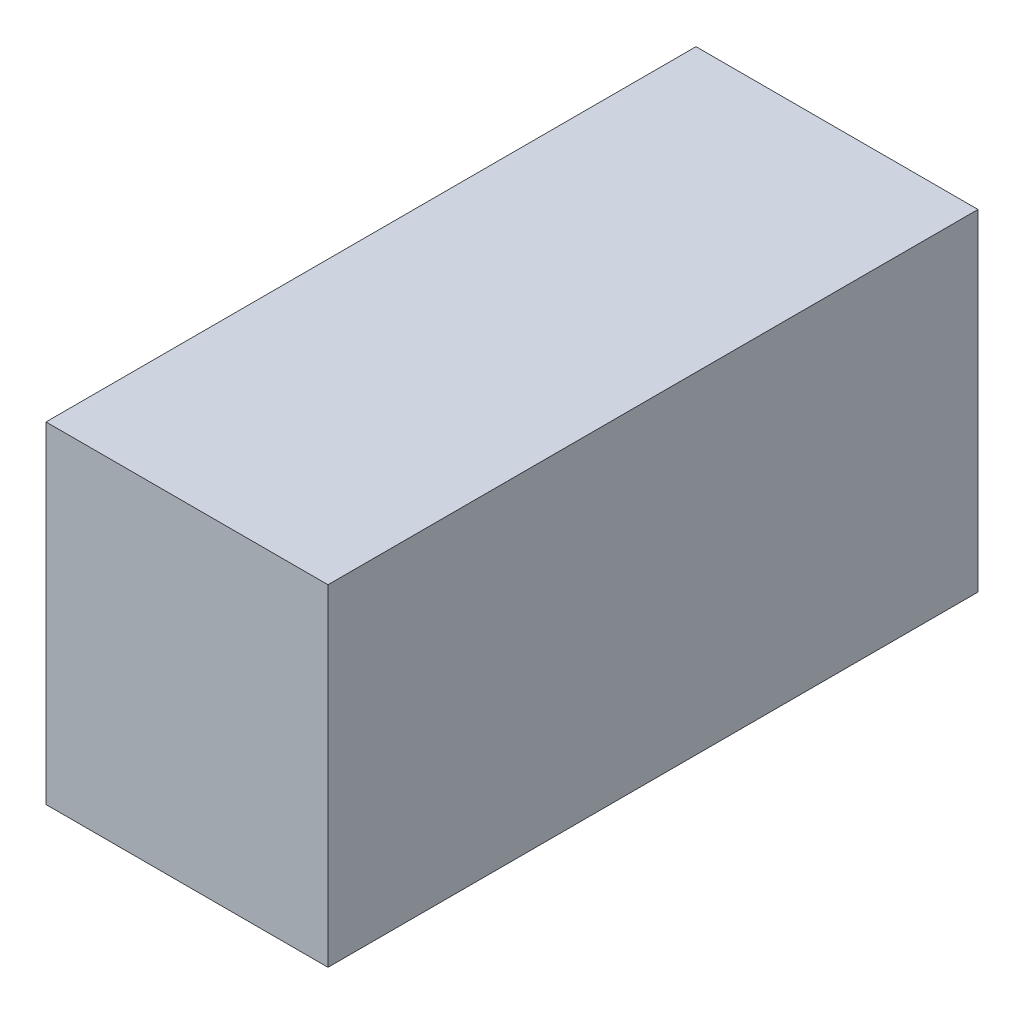
ISO-10303-21;
HEADER;
FILE_DESCRIPTION(('STEP AP214'),'2;1');
FILE_NAME('part.step','',(''),(''),'','','');
FILE_SCHEMA(('AUTOMOTIVE_DESIGN { 1 0 10303 214 1 1 1 1 }'));
ENDSEC;
DATA;
#1=APPLICATION_CONTEXT('core data for automotive mechanical design processes');
#2=APPLICATION_PROTOCOL_DEFINITION('international standard','automotive_design',2000,#1);
#3=PRODUCT_CONTEXT('',#1,'mechanical');
#4=PRODUCT('Part','Part','',(#3));
#5=PRODUCT_RELATED_PRODUCT_CATEGORY('part','',(#4));
#6=PRODUCT_DEFINITION_FORMATION('','',#4);
#7=PRODUCT_DEFINITION_CONTEXT('part definition',#1,'design');
#8=PRODUCT_DEFINITION('design','',#6,#7);
#9=PRODUCT_DEFINITION_SHAPE('','',#8);
#10=(LENGTH_UNIT() NAMED_UNIT(*) SI_UNIT(.MILLI.,.METRE.));
#11=(NAMED_UNIT(*) PLANE_ANGLE_UNIT() SI_UNIT($,.RADIAN.));
#12=(NAMED_UNIT(*) SI_UNIT($,.STERADIAN.) SOLID_ANGLE_UNIT());
#13=UNCERTAINTY_MEASURE_WITH_UNIT(LENGTH_MEASURE(1.E-05),#10,'distance_accuracy_value','');
#14=(GEOMETRIC_REPRESENTATION_CONTEXT(3) GLOBAL_UNCERTAINTY_ASSIGNED_CONTEXT((#13)) GLOBAL_UNIT_ASSIGNED_CONTEXT((#10,
#11,#12)) REPRESENTATION_CONTEXT('',''));
#15=CARTESIAN_POINT('',(0.,0.,0.));
#16=DIRECTION('',(0.,0.,1.));
#17=DIRECTION('',(1.,0.,0.));
#18=AXIS2_PLACEMENT_3D('',#15,#16,#17);
#19=CARTESIAN_POINT('',(10.,-11.75,46.1));
#20=DIRECTION('',(-1.,0.,0.));
#21=DIRECTION('',(0.,0.,1.));
#22=AXIS2_PLACEMENT_3D('',#19,#20,#21);
#23=PLANE('',#22);
#24=DIRECTION('',(0.,1.,0.));
#25=VECTOR('',#24,1.);
#26=CARTESIAN_POINT('',(10.,-11.75,0.));
#27=LINE('',#26,#25);
#28=CARTESIAN_POINT('',(10.,-11.75,0.));
#29=VERTEX_POINT('',#28);
#30=CARTESIAN_POINT('',(10.,11.75,0.));
#31=VERTEX_POINT('',#30);
#32=EDGE_CURVE('E102',#29,#31,#27,.T.);
#33=ORIENTED_EDGE('',*,*,#32,.T.);
#34=DIRECTION('',(0.,0.,-1.));
#35=VECTOR('',#34,1.);
#36=CARTESIAN_POINT('',(10.,11.75,46.1));
#37=LINE('',#36,#35);
#38=CARTESIAN_POINT('',(10.,11.75,46.1));
#39=VERTEX_POINT('',#38);
#40=EDGE_CURVE('E11',#39,#31,#37,.T.);
#41=ORIENTED_EDGE('',*,*,#40,.F.);
#42=DIRECTION('',(0.,1.,0.));
#43=VECTOR('',#42,1.);
#44=CARTESIAN_POINT('',(10.,-11.75,46.1));
#45=LINE('',#44,#43);
#46=CARTESIAN_POINT('',(10.,-11.75,46.1));
#47=VERTEX_POINT('',#46);
#48=EDGE_CURVE('E90',#47,#39,#45,.T.);
#49=ORIENTED_EDGE('',*,*,#48,.F.);
#50=DIRECTION('',(0.,0.,-1.));
#51=VECTOR('',#50,1.);
#52=CARTESIAN_POINT('',(10.,-11.75,46.1));
#53=LINE('',#52,#51);
#54=EDGE_CURVE('E98',#47,#29,#53,.T.);
#55=ORIENTED_EDGE('',*,*,#54,.T.);
#56=EDGE_LOOP('',(#33,#41,#49,#55));
#57=FACE_BOUND('',#56,.T.);
#58=ADVANCED_FACE('F39',(#57),#23,.F.);
#59=CARTESIAN_POINT('',(-10.,11.75,46.1));
#60=DIRECTION('',(0.,-1.,0.));
#61=DIRECTION('',(0.,0.,-1.));
#62=AXIS2_PLACEMENT_3D('',#59,#60,#61);
#63=PLANE('',#62);
#64=DIRECTION('',(-1.,0.,0.));
#65=VECTOR('',#64,1.);
#66=CARTESIAN_POINT('',(-10.,11.75,0.));
#67=LINE('',#66,#65);
#68=CARTESIAN_POINT('',(-10.,11.75,0.));
#69=VERTEX_POINT('',#68);
#70=EDGE_CURVE('E94',#31,#69,#67,.T.);
#71=ORIENTED_EDGE('',*,*,#70,.T.);
#72=DIRECTION('',(0.,0.,-1.));
#73=VECTOR('',#72,1.);
#74=CARTESIAN_POINT('',(-10.,11.75,46.1));
#75=LINE('',#74,#73);
#76=CARTESIAN_POINT('',(-10.,11.75,46.1));
#77=VERTEX_POINT('',#76);
#78=EDGE_CURVE('E47',#77,#69,#75,.T.);
#79=ORIENTED_EDGE('',*,*,#78,.F.);
#80=DIRECTION('',(-1.,0.,0.));
#81=VECTOR('',#80,1.);
#82=CARTESIAN_POINT('',(-10.,11.75,46.1));
#83=LINE('',#82,#81);
#84=EDGE_CURVE('E85',#39,#77,#83,.T.);
#85=ORIENTED_EDGE('',*,*,#84,.F.);
#86=ORIENTED_EDGE('',*,*,#40,.T.);
#87=EDGE_LOOP('',(#71,#79,#85,#86));
#88=FACE_BOUND('',#87,.T.);
#89=ADVANCED_FACE('F93',(#88),#63,.F.);
#90=CARTESIAN_POINT('',(-10.,-11.75,46.1));
#91=DIRECTION('',(1.,0.,0.));
#92=DIRECTION('',(0.,0.,-1.));
#93=AXIS2_PLACEMENT_3D('',#90,#91,#92);
#94=PLANE('',#93);
#95=DIRECTION('',(0.,-1.,0.));
#96=VECTOR('',#95,1.);
#97=CARTESIAN_POINT('',(-10.,-11.75,0.));
#98=LINE('',#97,#96);
#99=CARTESIAN_POINT('',(-10.,-11.75,0.));
#100=VERTEX_POINT('',#99);
#101=EDGE_CURVE('E72',#69,#100,#98,.T.);
#102=ORIENTED_EDGE('',*,*,#101,.T.);
#103=DIRECTION('',(0.,0.,-1.));
#104=VECTOR('',#103,1.);
#105=CARTESIAN_POINT('',(-10.,-11.75,46.1));
#106=LINE('',#105,#104);
#107=CARTESIAN_POINT('',(-10.,-11.75,46.1));
#108=VERTEX_POINT('',#107);
#109=EDGE_CURVE('E95',#108,#100,#106,.T.);
#110=ORIENTED_EDGE('',*,*,#109,.F.);
#111=DIRECTION('',(0.,-1.,0.));
#112=VECTOR('',#111,1.);
#113=CARTESIAN_POINT('',(-10.,-11.75,46.1));
#114=LINE('',#113,#112);
#115=EDGE_CURVE('E88',#77,#108,#114,.T.);
#116=ORIENTED_EDGE('',*,*,#115,.F.);
#117=ORIENTED_EDGE('',*,*,#78,.T.);
#118=EDGE_LOOP('',(#102,#110,#116,#117));
#119=FACE_BOUND('',#118,.T.);
#120=ADVANCED_FACE('F96',(#119),#94,.F.);
#121=CARTESIAN_POINT('',(-10.,-11.75,46.1));
#122=DIRECTION('',(0.,1.,0.));
#123=DIRECTION('',(0.,0.,1.));
#124=AXIS2_PLACEMENT_3D('',#121,#122,#123);
#125=PLANE('',#124);
#126=DIRECTION('',(1.,0.,0.));
#127=VECTOR('',#126,1.);
#128=CARTESIAN_POINT('',(-10.,-11.75,0.));
#129=LINE('',#128,#127);
#130=EDGE_CURVE('E78',#100,#29,#129,.T.);
#131=ORIENTED_EDGE('',*,*,#130,.T.);
#132=ORIENTED_EDGE('',*,*,#54,.F.);
#133=DIRECTION('',(1.,0.,0.));
#134=VECTOR('',#133,1.);
#135=CARTESIAN_POINT('',(-10.,-11.75,46.1));
#136=LINE('',#135,#134);
#137=EDGE_CURVE('E55',#108,#47,#136,.T.);
#138=ORIENTED_EDGE('',*,*,#137,.F.);
#139=ORIENTED_EDGE('',*,*,#109,.T.);
#140=EDGE_LOOP('',(#131,#132,#138,#139));
#141=FACE_BOUND('',#140,.T.);
#142=ADVANCED_FACE('F109',(#141),#125,.F.);
#143=CARTESIAN_POINT('',(0.,0.,46.1));
#144=DIRECTION('',(0.,0.,-1.));
#145=DIRECTION('',(-1.,0.,0.));
#146=AXIS2_PLACEMENT_3D('',#143,#144,#145);
#147=PLANE('',#146);
#148=ORIENTED_EDGE('',*,*,#48,.T.);
#149=ORIENTED_EDGE('',*,*,#84,.T.);
#150=ORIENTED_EDGE('',*,*,#115,.T.);
#151=ORIENTED_EDGE('',*,*,#137,.T.);
#152=EDGE_LOOP('',(#148,#149,#150,#151));
#153=FACE_BOUND('',#152,.T.);
#154=ADVANCED_FACE('F86',(#153),#147,.F.);
#155=CARTESIAN_POINT('',(0.,0.,0.));
#156=DIRECTION('',(0.,0.,-1.));
#157=DIRECTION('',(-1.,0.,0.));
#158=AXIS2_PLACEMENT_3D('',#155,#156,#157);
#159=PLANE('',#158);
#160=ORIENTED_EDGE('',*,*,#32,.F.);
#161=ORIENTED_EDGE('',*,*,#130,.F.);
#162=ORIENTED_EDGE('',*,*,#101,.F.);
#163=ORIENTED_EDGE('',*,*,#70,.F.);
#164=EDGE_LOOP('',(#160,#161,#162,#163));
#165=FACE_BOUND('',#164,.T.);
#166=ADVANCED_FACE('F112',(#165),#159,.T.);
#167=CLOSED_SHELL('',(#58,#89,#120,#142,#154,#166));
#168=MANIFOLD_SOLID_BREP('B2',#167);
#169=ADVANCED_BREP_SHAPE_REPRESENTATION('',(#18,#168),#14);
#170=SHAPE_DEFINITION_REPRESENTATION(#9,#169);
ENDSEC;
END-ISO-10303-21;
